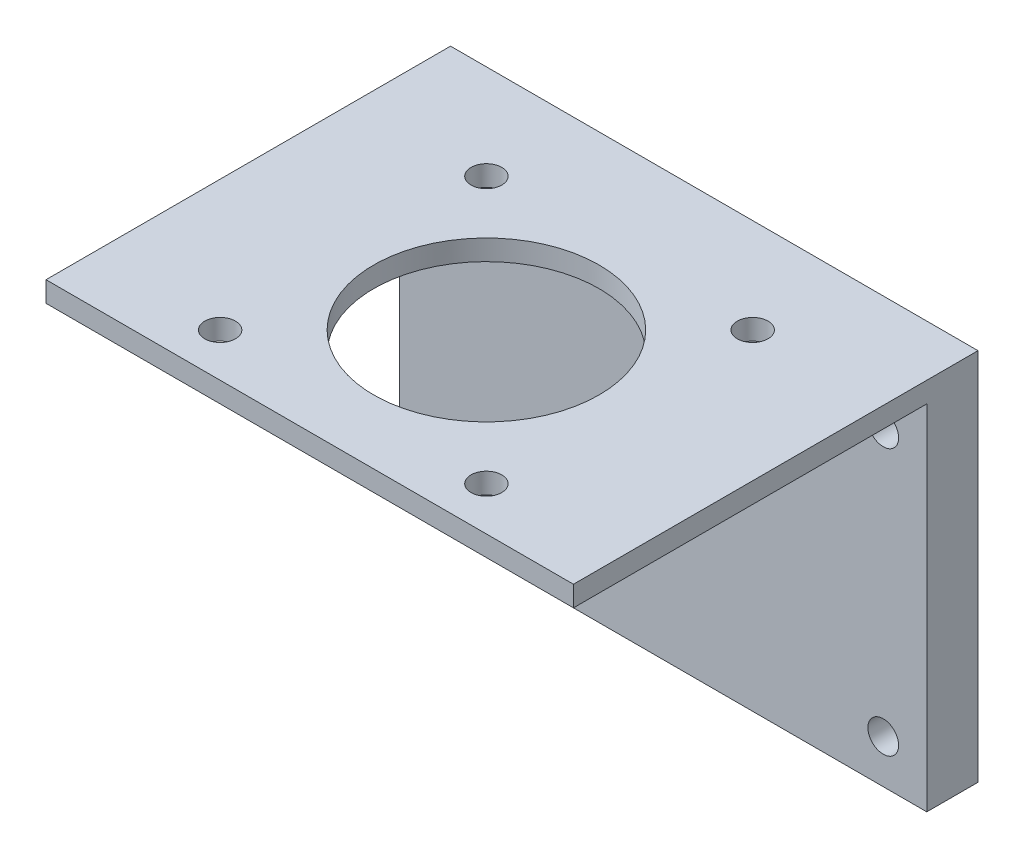
ISO-10303-21;
HEADER;
FILE_DESCRIPTION(('STEP AP214'),'2;1');
FILE_NAME('part.step','',(''),(''),'','','');
FILE_SCHEMA(('AUTOMOTIVE_DESIGN { 1 0 10303 214 1 1 1 1 }'));
ENDSEC;
DATA;
#1=APPLICATION_CONTEXT('core data for automotive mechanical design processes');
#2=APPLICATION_PROTOCOL_DEFINITION('international standard','automotive_design',2000,#1);
#3=PRODUCT_CONTEXT('',#1,'mechanical');
#4=PRODUCT('Part','Part','',(#3));
#5=PRODUCT_RELATED_PRODUCT_CATEGORY('part','',(#4));
#6=PRODUCT_DEFINITION_FORMATION('','',#4);
#7=PRODUCT_DEFINITION_CONTEXT('part definition',#1,'design');
#8=PRODUCT_DEFINITION('design','',#6,#7);
#9=PRODUCT_DEFINITION_SHAPE('','',#8);
#10=(LENGTH_UNIT() NAMED_UNIT(*) SI_UNIT(.MILLI.,.METRE.));
#11=(NAMED_UNIT(*) PLANE_ANGLE_UNIT() SI_UNIT($,.RADIAN.));
#12=(NAMED_UNIT(*) SI_UNIT($,.STERADIAN.) SOLID_ANGLE_UNIT());
#13=UNCERTAINTY_MEASURE_WITH_UNIT(LENGTH_MEASURE(1.E-05),#10,'distance_accuracy_value','');
#14=(GEOMETRIC_REPRESENTATION_CONTEXT(3) GLOBAL_UNCERTAINTY_ASSIGNED_CONTEXT((#13)) GLOBAL_UNIT_ASSIGNED_CONTEXT((#10,
#11,#12)) REPRESENTATION_CONTEXT('',''));
#15=CARTESIAN_POINT('',(0.,0.,0.));
#16=DIRECTION('',(0.,0.,1.));
#17=DIRECTION('',(1.,0.,0.));
#18=AXIS2_PLACEMENT_3D('',#15,#16,#17);
#19=CARTESIAN_POINT('',(-14.63219974067,10.8656583629893,5.));
#20=DIRECTION('',(1.,0.,0.));
#21=DIRECTION('',(0.,1.,0.));
#22=AXIS2_PLACEMENT_3D('',#19,#20,#21);
#23=PLANE('',#22);
#24=DIRECTION('',(0.,-1.,0.));
#25=VECTOR('',#24,1.);
#26=CARTESIAN_POINT('',(-14.63219974067,10.8656583629893,0.));
#27=LINE('',#26,#25);
#28=CARTESIAN_POINT('',(-14.63219974067,10.8656583629893,0.));
#29=VERTEX_POINT('',#28);
#30=CARTESIAN_POINT('',(-14.63219974067,-25.6343416370107,0.));
#31=VERTEX_POINT('',#30);
#32=EDGE_CURVE('E91',#29,#31,#27,.T.);
#33=ORIENTED_EDGE('',*,*,#32,.T.);
#34=DIRECTION('',(0.,0.,-1.));
#35=VECTOR('',#34,1.);
#36=CARTESIAN_POINT('',(-14.63219974067,-25.6343416370107,5.));
#37=LINE('',#36,#35);
#38=CARTESIAN_POINT('',(-14.63219974067,-25.6343416370107,5.));
#39=VERTEX_POINT('',#38);
#40=EDGE_CURVE('E11',#39,#31,#37,.T.);
#41=ORIENTED_EDGE('',*,*,#40,.F.);
#42=DIRECTION('',(0.,-1.,0.));
#43=VECTOR('',#42,1.);
#44=CARTESIAN_POINT('',(-14.63219974067,10.8656583629893,5.));
#45=LINE('',#44,#43);
#46=CARTESIAN_POINT('',(-14.63219974067,8.86565836298932,5.));
#47=VERTEX_POINT('',#46);
#48=EDGE_CURVE('E85',#47,#39,#45,.T.);
#49=ORIENTED_EDGE('',*,*,#48,.F.);
#50=DIRECTION('',(0.,0.,-1.));
#51=VECTOR('',#50,1.);
#52=CARTESIAN_POINT('',(-14.63219974067,8.86565836298932,39.5));
#53=LINE('',#52,#51);
#54=CARTESIAN_POINT('',(-14.63219974067,8.86565836298932,39.5));
#55=VERTEX_POINT('',#54);
#56=EDGE_CURVE('E119',#55,#47,#53,.T.);
#57=ORIENTED_EDGE('',*,*,#56,.F.);
#58=DIRECTION('',(0.,-1.,0.));
#59=VECTOR('',#58,1.);
#60=CARTESIAN_POINT('',(-14.63219974067,10.8656583629893,39.5));
#61=LINE('',#60,#59);
#62=CARTESIAN_POINT('',(-14.63219974067,10.8656583629893,39.5));
#63=VERTEX_POINT('',#62);
#64=EDGE_CURVE('E94',#63,#55,#61,.T.);
#65=ORIENTED_EDGE('',*,*,#64,.F.);
#66=DIRECTION('',(0.,0.,-1.));
#67=VECTOR('',#66,1.);
#68=CARTESIAN_POINT('',(-14.63219974067,10.8656583629893,5.));
#69=LINE('',#68,#67);
#70=EDGE_CURVE('E78',#63,#29,#69,.T.);
#71=ORIENTED_EDGE('',*,*,#70,.T.);
#72=EDGE_LOOP('',(#33,#41,#49,#57,#65,#71));
#73=FACE_BOUND('',#72,.T.);
#74=ADVANCED_FACE('F33',(#73),#23,.F.);
#75=CARTESIAN_POINT('',(-14.63219974067,-25.6343416370107,5.));
#76=DIRECTION('',(0.,1.,0.));
#77=DIRECTION('',(0.,0.,1.));
#78=AXIS2_PLACEMENT_3D('',#75,#76,#77);
#79=PLANE('',#78);
#80=DIRECTION('',(1.,0.,0.));
#81=VECTOR('',#80,1.);
#82=CARTESIAN_POINT('',(-14.63219974067,-25.6343416370107,0.));
#83=LINE('',#82,#81);
#84=CARTESIAN_POINT('',(36.86780025933,-25.6343416370107,0.));
#85=VERTEX_POINT('',#84);
#86=EDGE_CURVE('E99',#31,#85,#83,.T.);
#87=ORIENTED_EDGE('',*,*,#86,.T.);
#88=DIRECTION('',(0.,0.,-1.));
#89=VECTOR('',#88,1.);
#90=CARTESIAN_POINT('',(36.86780025933,-25.6343416370107,5.));
#91=LINE('',#90,#89);
#92=CARTESIAN_POINT('',(36.86780025933,-25.6343416370107,5.));
#93=VERTEX_POINT('',#92);
#94=EDGE_CURVE('E40',#93,#85,#91,.T.);
#95=ORIENTED_EDGE('',*,*,#94,.F.);
#96=DIRECTION('',(1.,0.,0.));
#97=VECTOR('',#96,1.);
#98=CARTESIAN_POINT('',(-14.63219974067,-25.6343416370107,5.));
#99=LINE('',#98,#97);
#100=EDGE_CURVE('E53',#39,#93,#99,.T.);
#101=ORIENTED_EDGE('',*,*,#100,.F.);
#102=ORIENTED_EDGE('',*,*,#40,.T.);
#103=EDGE_LOOP('',(#87,#95,#101,#102));
#104=FACE_BOUND('',#103,.T.);
#105=ADVANCED_FACE('F116',(#104),#79,.F.);
#106=CARTESIAN_POINT('',(36.86780025933,10.8656583629893,5.));
#107=DIRECTION('',(-1.,0.,0.));
#108=DIRECTION('',(0.,-1.,0.));
#109=AXIS2_PLACEMENT_3D('',#106,#107,#108);
#110=PLANE('',#109);
#111=DIRECTION('',(0.,1.,0.));
#112=VECTOR('',#111,1.);
#113=CARTESIAN_POINT('',(36.86780025933,10.8656583629893,0.));
#114=LINE('',#113,#112);
#115=CARTESIAN_POINT('',(36.86780025933,10.8656583629893,0.));
#116=VERTEX_POINT('',#115);
#117=EDGE_CURVE('E86',#85,#116,#114,.T.);
#118=ORIENTED_EDGE('',*,*,#117,.T.);
#119=DIRECTION('',(0.,0.,-1.));
#120=VECTOR('',#119,1.);
#121=CARTESIAN_POINT('',(36.86780025933,10.8656583629893,5.));
#122=LINE('',#121,#120);
#123=CARTESIAN_POINT('',(36.86780025933,10.8656583629893,39.5));
#124=VERTEX_POINT('',#123);
#125=EDGE_CURVE('E81',#124,#116,#122,.T.);
#126=ORIENTED_EDGE('',*,*,#125,.F.);
#127=DIRECTION('',(0.,1.,0.));
#128=VECTOR('',#127,1.);
#129=CARTESIAN_POINT('',(36.86780025933,8.86565836298932,39.5));
#130=LINE('',#129,#128);
#131=CARTESIAN_POINT('',(36.86780025933,8.86565836298932,39.5));
#132=VERTEX_POINT('',#131);
#133=EDGE_CURVE('E134',#132,#124,#130,.T.);
#134=ORIENTED_EDGE('',*,*,#133,.F.);
#135=DIRECTION('',(0.,0.,-1.));
#136=VECTOR('',#135,1.);
#137=CARTESIAN_POINT('',(36.86780025933,8.86565836298932,39.5));
#138=LINE('',#137,#136);
#139=CARTESIAN_POINT('',(36.86780025933,8.86565836298932,5.));
#140=VERTEX_POINT('',#139);
#141=EDGE_CURVE('E129',#132,#140,#138,.T.);
#142=ORIENTED_EDGE('',*,*,#141,.T.);
#143=DIRECTION('',(0.,1.,0.));
#144=VECTOR('',#143,1.);
#145=CARTESIAN_POINT('',(36.86780025933,10.8656583629893,5.));
#146=LINE('',#145,#144);
#147=EDGE_CURVE('E96',#93,#140,#146,.T.);
#148=ORIENTED_EDGE('',*,*,#147,.F.);
#149=ORIENTED_EDGE('',*,*,#94,.T.);
#150=EDGE_LOOP('',(#118,#126,#134,#142,#148,#149));
#151=FACE_BOUND('',#150,.T.);
#152=ADVANCED_FACE('F113',(#151),#110,.F.);
#153=CARTESIAN_POINT('',(-14.63219974067,10.8656583629893,5.));
#154=DIRECTION('',(0.,-1.,0.));
#155=DIRECTION('',(0.,0.,-1.));
#156=AXIS2_PLACEMENT_3D('',#153,#154,#155);
#157=PLANE('',#156);
#158=CARTESIAN_POINT('',(24.11780025933,10.8656583629893,35.25));
#159=DIRECTION('',(0.,-1.,0.));
#160=DIRECTION('',(0.,0.,-1.));
#161=AXIS2_PLACEMENT_3D('',#158,#159,#160);
#162=CIRCLE('',#161,1.5);
#163=CARTESIAN_POINT('',(24.11780025933,10.8656583629893,33.75));
#164=VERTEX_POINT('',#163);
#165=EDGE_CURVE('E169',#164,#164,#162,.T.);
#166=ORIENTED_EDGE('',*,*,#165,.T.);
#167=EDGE_LOOP('',(#166));
#168=FACE_BOUND('',#167,.T.);
#169=CARTESIAN_POINT('',(-1.88219974066997,10.8656583629893,9.25));
#170=DIRECTION('',(0.,-1.,0.));
#171=DIRECTION('',(0.,0.,-1.));
#172=AXIS2_PLACEMENT_3D('',#169,#170,#171);
#173=CIRCLE('',#172,1.5);
#174=CARTESIAN_POINT('',(-1.88219974066997,10.8656583629893,7.75));
#175=VERTEX_POINT('',#174);
#176=EDGE_CURVE('E171',#175,#175,#173,.T.);
#177=ORIENTED_EDGE('',*,*,#176,.T.);
#178=EDGE_LOOP('',(#177));
#179=FACE_BOUND('',#178,.T.);
#180=CARTESIAN_POINT('',(24.11780025933,10.8656583629893,9.25));
#181=DIRECTION('',(0.,-1.,0.));
#182=DIRECTION('',(0.,0.,-1.));
#183=AXIS2_PLACEMENT_3D('',#180,#181,#182);
#184=CIRCLE('',#183,1.5);
#185=CARTESIAN_POINT('',(24.11780025933,10.8656583629893,7.75));
#186=VERTEX_POINT('',#185);
#187=EDGE_CURVE('E175',#186,#186,#184,.T.);
#188=ORIENTED_EDGE('',*,*,#187,.T.);
#189=EDGE_LOOP('',(#188));
#190=FACE_BOUND('',#189,.T.);
#191=CARTESIAN_POINT('',(11.11780025933,10.8656583629893,22.25));
#192=DIRECTION('',(0.,-1.,0.));
#193=DIRECTION('',(0.,0.,-1.));
#194=AXIS2_PLACEMENT_3D('',#191,#192,#193);
#195=CIRCLE('',#194,11.);
#196=CARTESIAN_POINT('',(11.11780025933,10.8656583629893,11.25));
#197=VERTEX_POINT('',#196);
#198=EDGE_CURVE('E180',#197,#197,#195,.T.);
#199=ORIENTED_EDGE('',*,*,#198,.T.);
#200=EDGE_LOOP('',(#199));
#201=FACE_BOUND('',#200,.T.);
#202=CARTESIAN_POINT('',(-1.88219974066997,10.8656583629893,35.25));
#203=DIRECTION('',(0.,-1.,0.));
#204=DIRECTION('',(0.,0.,-1.));
#205=AXIS2_PLACEMENT_3D('',#202,#203,#204);
#206=CIRCLE('',#205,1.5);
#207=CARTESIAN_POINT('',(-1.88219974066997,10.8656583629893,33.75));
#208=VERTEX_POINT('',#207);
#209=EDGE_CURVE('E183',#208,#208,#206,.T.);
#210=ORIENTED_EDGE('',*,*,#209,.T.);
#211=EDGE_LOOP('',(#210));
#212=FACE_BOUND('',#211,.T.);
#213=DIRECTION('',(-1.,0.,0.));
#214=VECTOR('',#213,1.);
#215=CARTESIAN_POINT('',(-14.63219974067,10.8656583629893,0.));
#216=LINE('',#215,#214);
#217=EDGE_CURVE('E73',#116,#29,#216,.T.);
#218=ORIENTED_EDGE('',*,*,#217,.T.);
#219=ORIENTED_EDGE('',*,*,#70,.F.);
#220=DIRECTION('',(-1.,0.,0.));
#221=VECTOR('',#220,1.);
#222=CARTESIAN_POINT('',(36.86780025933,10.8656583629893,39.5));
#223=LINE('',#222,#221);
#224=EDGE_CURVE('E163',#124,#63,#223,.T.);
#225=ORIENTED_EDGE('',*,*,#224,.F.);
#226=ORIENTED_EDGE('',*,*,#125,.T.);
#227=EDGE_LOOP('',(#218,#219,#225,#226));
#228=FACE_BOUND('',#227,.T.);
#229=ADVANCED_FACE('F75',(#168,#179,#190,#201,#212,#228),#157,.F.);
#230=CARTESIAN_POINT('',(0.,0.,5.));
#231=DIRECTION('',(0.,0.,1.));
#232=DIRECTION('',(1.,0.,0.));
#233=AXIS2_PLACEMENT_3D('',#230,#231,#232);
#234=PLANE('',#233);
#235=DIRECTION('',(1.,0.,0.));
#236=VECTOR('',#235,1.);
#237=CARTESIAN_POINT('',(-14.63219974067,8.86565836298932,5.));
#238=LINE('',#237,#236);
#239=EDGE_CURVE('E47',#47,#140,#238,.T.);
#240=ORIENTED_EDGE('',*,*,#239,.F.);
#241=ORIENTED_EDGE('',*,*,#48,.T.);
#242=ORIENTED_EDGE('',*,*,#100,.T.);
#243=ORIENTED_EDGE('',*,*,#147,.T.);
#244=EDGE_LOOP('',(#240,#241,#242,#243));
#245=FACE_BOUND('',#244,.T.);
#246=CARTESIAN_POINT('',(32.61780025933,4.61565836298932,5.));
#247=DIRECTION('',(0.,0.,1.));
#248=DIRECTION('',(1.,0.,0.));
#249=AXIS2_PLACEMENT_3D('',#246,#247,#248);
#250=CIRCLE('',#249,1.5);
#251=CARTESIAN_POINT('',(34.11780025933,4.61565836298932,5.));
#252=VERTEX_POINT('',#251);
#253=EDGE_CURVE('E128',#252,#252,#250,.T.);
#254=ORIENTED_EDGE('',*,*,#253,.F.);
#255=EDGE_LOOP('',(#254));
#256=FACE_BOUND('',#255,.T.);
#257=CARTESIAN_POINT('',(32.61780025933,-21.3843416370107,5.));
#258=DIRECTION('',(0.,0.,1.));
#259=DIRECTION('',(1.,0.,0.));
#260=AXIS2_PLACEMENT_3D('',#257,#258,#259);
#261=CIRCLE('',#260,1.5);
#262=CARTESIAN_POINT('',(34.11780025933,-21.3843416370107,5.));
#263=VERTEX_POINT('',#262);
#264=EDGE_CURVE('E147',#263,#263,#261,.T.);
#265=ORIENTED_EDGE('',*,*,#264,.F.);
#266=EDGE_LOOP('',(#265));
#267=FACE_BOUND('',#266,.T.);
#268=CARTESIAN_POINT('',(-10.38219974067,-21.3843416370107,5.));
#269=DIRECTION('',(0.,0.,1.));
#270=DIRECTION('',(1.,0.,0.));
#271=AXIS2_PLACEMENT_3D('',#268,#269,#270);
#272=CIRCLE('',#271,1.5);
#273=CARTESIAN_POINT('',(-8.88219974066997,-21.3843416370107,5.));
#274=VERTEX_POINT('',#273);
#275=EDGE_CURVE('E141',#274,#274,#272,.T.);
#276=ORIENTED_EDGE('',*,*,#275,.F.);
#277=EDGE_LOOP('',(#276));
#278=FACE_BOUND('',#277,.T.);
#279=CARTESIAN_POINT('',(-10.38219974067,4.61565836298932,5.));
#280=DIRECTION('',(0.,0.,1.));
#281=DIRECTION('',(1.,0.,0.));
#282=AXIS2_PLACEMENT_3D('',#279,#280,#281);
#283=CIRCLE('',#282,1.5);
#284=CARTESIAN_POINT('',(-8.88219974066997,4.61565836298932,5.));
#285=VERTEX_POINT('',#284);
#286=EDGE_CURVE('E104',#285,#285,#283,.T.);
#287=ORIENTED_EDGE('',*,*,#286,.F.);
#288=EDGE_LOOP('',(#287));
#289=FACE_BOUND('',#288,.T.);
#290=ADVANCED_FACE('F153',(#245,#256,#267,#278,#289),#234,.T.);
#291=CARTESIAN_POINT('',(0.,0.,0.));
#292=DIRECTION('',(0.,0.,1.));
#293=DIRECTION('',(1.,0.,0.));
#294=AXIS2_PLACEMENT_3D('',#291,#292,#293);
#295=PLANE('',#294);
#296=CARTESIAN_POINT('',(32.61780025933,4.61565836298932,0.));
#297=DIRECTION('',(0.,0.,1.));
#298=DIRECTION('',(1.,0.,0.));
#299=AXIS2_PLACEMENT_3D('',#296,#297,#298);
#300=CIRCLE('',#299,1.5);
#301=CARTESIAN_POINT('',(34.11780025933,4.61565836298932,0.));
#302=VERTEX_POINT('',#301);
#303=EDGE_CURVE('E132',#302,#302,#300,.T.);
#304=ORIENTED_EDGE('',*,*,#303,.T.);
#305=EDGE_LOOP('',(#304));
#306=FACE_BOUND('',#305,.T.);
#307=CARTESIAN_POINT('',(32.61780025933,-21.3843416370107,0.));
#308=DIRECTION('',(0.,0.,1.));
#309=DIRECTION('',(1.,0.,0.));
#310=AXIS2_PLACEMENT_3D('',#307,#308,#309);
#311=CIRCLE('',#310,1.5);
#312=CARTESIAN_POINT('',(34.11780025933,-21.3843416370107,0.));
#313=VERTEX_POINT('',#312);
#314=EDGE_CURVE('E144',#313,#313,#311,.T.);
#315=ORIENTED_EDGE('',*,*,#314,.T.);
#316=EDGE_LOOP('',(#315));
#317=FACE_BOUND('',#316,.T.);
#318=CARTESIAN_POINT('',(-10.38219974067,-21.3843416370107,0.));
#319=DIRECTION('',(0.,0.,1.));
#320=DIRECTION('',(1.,0.,0.));
#321=AXIS2_PLACEMENT_3D('',#318,#319,#320);
#322=CIRCLE('',#321,1.5);
#323=CARTESIAN_POINT('',(-8.88219974066997,-21.3843416370107,0.));
#324=VERTEX_POINT('',#323);
#325=EDGE_CURVE('E138',#324,#324,#322,.T.);
#326=ORIENTED_EDGE('',*,*,#325,.T.);
#327=EDGE_LOOP('',(#326));
#328=FACE_BOUND('',#327,.T.);
#329=CARTESIAN_POINT('',(-10.38219974067,4.61565836298932,0.));
#330=DIRECTION('',(0.,0.,1.));
#331=DIRECTION('',(1.,0.,0.));
#332=AXIS2_PLACEMENT_3D('',#329,#330,#331);
#333=CIRCLE('',#332,1.5);
#334=CARTESIAN_POINT('',(-8.88219974066997,4.61565836298932,0.));
#335=VERTEX_POINT('',#334);
#336=EDGE_CURVE('E100',#335,#335,#333,.T.);
#337=ORIENTED_EDGE('',*,*,#336,.T.);
#338=EDGE_LOOP('',(#337));
#339=FACE_BOUND('',#338,.T.);
#340=ORIENTED_EDGE('',*,*,#32,.F.);
#341=ORIENTED_EDGE('',*,*,#217,.F.);
#342=ORIENTED_EDGE('',*,*,#117,.F.);
#343=ORIENTED_EDGE('',*,*,#86,.F.);
#344=EDGE_LOOP('',(#340,#341,#342,#343));
#345=FACE_BOUND('',#344,.T.);
#346=ADVANCED_FACE('F98',(#306,#317,#328,#339,#345),#295,.F.);
#347=CARTESIAN_POINT('',(-10.38219974067,4.61565836298932,0.));
#348=DIRECTION('',(0.,0.,1.));
#349=DIRECTION('',(1.,0.,0.));
#350=AXIS2_PLACEMENT_3D('',#347,#348,#349);
#351=CYLINDRICAL_SURFACE('',#350,1.5);
#352=ORIENTED_EDGE('',*,*,#336,.F.);
#353=EDGE_LOOP('',(#352));
#354=FACE_BOUND('',#353,.T.);
#355=ORIENTED_EDGE('',*,*,#286,.T.);
#356=EDGE_LOOP('',(#355));
#357=FACE_BOUND('',#356,.T.);
#358=ADVANCED_FACE('F327',(#354,#357),#351,.F.);
#359=CARTESIAN_POINT('',(-10.38219974067,-21.3843416370107,0.));
#360=DIRECTION('',(0.,0.,1.));
#361=DIRECTION('',(1.,0.,0.));
#362=AXIS2_PLACEMENT_3D('',#359,#360,#361);
#363=CYLINDRICAL_SURFACE('',#362,1.5);
#364=ORIENTED_EDGE('',*,*,#325,.F.);
#365=EDGE_LOOP('',(#364));
#366=FACE_BOUND('',#365,.T.);
#367=ORIENTED_EDGE('',*,*,#275,.T.);
#368=EDGE_LOOP('',(#367));
#369=FACE_BOUND('',#368,.T.);
#370=ADVANCED_FACE('F323',(#366,#369),#363,.F.);
#371=CARTESIAN_POINT('',(32.61780025933,-21.3843416370107,0.));
#372=DIRECTION('',(0.,0.,1.));
#373=DIRECTION('',(1.,0.,0.));
#374=AXIS2_PLACEMENT_3D('',#371,#372,#373);
#375=CYLINDRICAL_SURFACE('',#374,1.5);
#376=ORIENTED_EDGE('',*,*,#314,.F.);
#377=EDGE_LOOP('',(#376));
#378=FACE_BOUND('',#377,.T.);
#379=ORIENTED_EDGE('',*,*,#264,.T.);
#380=EDGE_LOOP('',(#379));
#381=FACE_BOUND('',#380,.T.);
#382=ADVANCED_FACE('F326',(#378,#381),#375,.F.);
#383=CARTESIAN_POINT('',(32.61780025933,4.61565836298932,0.));
#384=DIRECTION('',(0.,0.,1.));
#385=DIRECTION('',(1.,0.,0.));
#386=AXIS2_PLACEMENT_3D('',#383,#384,#385);
#387=CYLINDRICAL_SURFACE('',#386,1.5);
#388=ORIENTED_EDGE('',*,*,#303,.F.);
#389=EDGE_LOOP('',(#388));
#390=FACE_BOUND('',#389,.T.);
#391=ORIENTED_EDGE('',*,*,#253,.T.);
#392=EDGE_LOOP('',(#391));
#393=FACE_BOUND('',#392,.T.);
#394=ADVANCED_FACE('F207',(#390,#393),#387,.F.);
#395=CARTESIAN_POINT('',(-14.63219974067,8.86565836298932,39.5));
#396=DIRECTION('',(0.,1.,0.));
#397=DIRECTION('',(-1.,0.,0.));
#398=AXIS2_PLACEMENT_3D('',#395,#396,#397);
#399=PLANE('',#398);
#400=CARTESIAN_POINT('',(24.11780025933,8.86565836298932,35.25));
#401=DIRECTION('',(0.,-1.,0.));
#402=DIRECTION('',(1.,0.,0.));
#403=AXIS2_PLACEMENT_3D('',#400,#401,#402);
#404=CIRCLE('',#403,1.5);
#405=CARTESIAN_POINT('',(25.61780025933,8.86565836298932,35.25));
#406=VERTEX_POINT('',#405);
#407=EDGE_CURVE('E189',#406,#406,#404,.T.);
#408=ORIENTED_EDGE('',*,*,#407,.F.);
#409=EDGE_LOOP('',(#408));
#410=FACE_BOUND('',#409,.T.);
#411=CARTESIAN_POINT('',(-1.88219974066997,8.86565836298932,9.25));
#412=DIRECTION('',(0.,-1.,0.));
#413=DIRECTION('',(1.,0.,0.));
#414=AXIS2_PLACEMENT_3D('',#411,#412,#413);
#415=CIRCLE('',#414,1.5);
#416=CARTESIAN_POINT('',(-0.382199740669972,8.86565836298932,9.25));
#417=VERTEX_POINT('',#416);
#418=EDGE_CURVE('E190',#417,#417,#415,.T.);
#419=ORIENTED_EDGE('',*,*,#418,.F.);
#420=EDGE_LOOP('',(#419));
#421=FACE_BOUND('',#420,.T.);
#422=CARTESIAN_POINT('',(24.11780025933,8.86565836298932,9.25));
#423=DIRECTION('',(0.,-1.,0.));
#424=DIRECTION('',(1.,0.,0.));
#425=AXIS2_PLACEMENT_3D('',#422,#423,#424);
#426=CIRCLE('',#425,1.5);
#427=CARTESIAN_POINT('',(25.61780025933,8.86565836298932,9.25));
#428=VERTEX_POINT('',#427);
#429=EDGE_CURVE('E193',#428,#428,#426,.T.);
#430=ORIENTED_EDGE('',*,*,#429,.F.);
#431=EDGE_LOOP('',(#430));
#432=FACE_BOUND('',#431,.T.);
#433=CARTESIAN_POINT('',(11.11780025933,8.86565836298932,22.25));
#434=DIRECTION('',(0.,-1.,0.));
#435=DIRECTION('',(1.,0.,0.));
#436=AXIS2_PLACEMENT_3D('',#433,#434,#435);
#437=CIRCLE('',#436,11.);
#438=CARTESIAN_POINT('',(22.11780025933,8.86565836298932,22.25));
#439=VERTEX_POINT('',#438);
#440=EDGE_CURVE('E196',#439,#439,#437,.T.);
#441=ORIENTED_EDGE('',*,*,#440,.F.);
#442=EDGE_LOOP('',(#441));
#443=FACE_BOUND('',#442,.T.);
#444=CARTESIAN_POINT('',(-1.88219974066997,8.86565836298932,35.25));
#445=DIRECTION('',(0.,-1.,0.));
#446=DIRECTION('',(1.,0.,0.));
#447=AXIS2_PLACEMENT_3D('',#444,#445,#446);
#448=CIRCLE('',#447,1.5);
#449=CARTESIAN_POINT('',(-0.382199740669971,8.86565836298932,35.25));
#450=VERTEX_POINT('',#449);
#451=EDGE_CURVE('E186',#450,#450,#448,.T.);
#452=ORIENTED_EDGE('',*,*,#451,.F.);
#453=EDGE_LOOP('',(#452));
#454=FACE_BOUND('',#453,.T.);
#455=ORIENTED_EDGE('',*,*,#239,.T.);
#456=ORIENTED_EDGE('',*,*,#141,.F.);
#457=DIRECTION('',(1.,0.,0.));
#458=VECTOR('',#457,1.);
#459=CARTESIAN_POINT('',(-14.63219974067,8.86565836298932,39.5));
#460=LINE('',#459,#458);
#461=EDGE_CURVE('E127',#55,#132,#460,.T.);
#462=ORIENTED_EDGE('',*,*,#461,.F.);
#463=ORIENTED_EDGE('',*,*,#56,.T.);
#464=EDGE_LOOP('',(#455,#456,#462,#463));
#465=FACE_BOUND('',#464,.T.);
#466=ADVANCED_FACE('F123',(#410,#421,#432,#443,#454,#465),#399,.F.);
#467=CARTESIAN_POINT('',(0.,0.,39.5));
#468=DIRECTION('',(0.,0.,1.));
#469=DIRECTION('',(1.,0.,0.));
#470=AXIS2_PLACEMENT_3D('',#467,#468,#469);
#471=PLANE('',#470);
#472=ORIENTED_EDGE('',*,*,#224,.T.);
#473=ORIENTED_EDGE('',*,*,#64,.T.);
#474=ORIENTED_EDGE('',*,*,#461,.T.);
#475=ORIENTED_EDGE('',*,*,#133,.T.);
#476=EDGE_LOOP('',(#472,#473,#474,#475));
#477=FACE_BOUND('',#476,.T.);
#478=ADVANCED_FACE('F161',(#477),#471,.T.);
#479=CARTESIAN_POINT('',(-1.88219974066997,43.3656583629893,35.25));
#480=DIRECTION('',(0.,-1.,0.));
#481=DIRECTION('',(1.,0.,0.));
#482=AXIS2_PLACEMENT_3D('',#479,#480,#481);
#483=CYLINDRICAL_SURFACE('',#482,1.5);
#484=ORIENTED_EDGE('',*,*,#451,.T.);
#485=EDGE_LOOP('',(#484));
#486=FACE_BOUND('',#485,.T.);
#487=ORIENTED_EDGE('',*,*,#209,.F.);
#488=EDGE_LOOP('',(#487));
#489=FACE_BOUND('',#488,.T.);
#490=ADVANCED_FACE('F214',(#486,#489),#483,.F.);
#491=CARTESIAN_POINT('',(11.11780025933,43.3656583629893,22.25));
#492=DIRECTION('',(0.,-1.,0.));
#493=DIRECTION('',(1.,0.,0.));
#494=AXIS2_PLACEMENT_3D('',#491,#492,#493);
#495=CYLINDRICAL_SURFACE('',#494,11.);
#496=ORIENTED_EDGE('',*,*,#440,.T.);
#497=EDGE_LOOP('',(#496));
#498=FACE_BOUND('',#497,.T.);
#499=ORIENTED_EDGE('',*,*,#198,.F.);
#500=EDGE_LOOP('',(#499));
#501=FACE_BOUND('',#500,.T.);
#502=ADVANCED_FACE('F217',(#498,#501),#495,.F.);
#503=CARTESIAN_POINT('',(24.11780025933,43.3656583629893,9.25));
#504=DIRECTION('',(0.,-1.,0.));
#505=DIRECTION('',(1.,0.,0.));
#506=AXIS2_PLACEMENT_3D('',#503,#504,#505);
#507=CYLINDRICAL_SURFACE('',#506,1.5);
#508=ORIENTED_EDGE('',*,*,#429,.T.);
#509=EDGE_LOOP('',(#508));
#510=FACE_BOUND('',#509,.T.);
#511=ORIENTED_EDGE('',*,*,#187,.F.);
#512=EDGE_LOOP('',(#511));
#513=FACE_BOUND('',#512,.T.);
#514=ADVANCED_FACE('F202',(#510,#513),#507,.F.);
#515=CARTESIAN_POINT('',(-1.88219974066997,43.3656583629893,9.25));
#516=DIRECTION('',(0.,-1.,0.));
#517=DIRECTION('',(1.,0.,0.));
#518=AXIS2_PLACEMENT_3D('',#515,#516,#517);
#519=CYLINDRICAL_SURFACE('',#518,1.5);
#520=ORIENTED_EDGE('',*,*,#418,.T.);
#521=EDGE_LOOP('',(#520));
#522=FACE_BOUND('',#521,.T.);
#523=ORIENTED_EDGE('',*,*,#176,.F.);
#524=EDGE_LOOP('',(#523));
#525=FACE_BOUND('',#524,.T.);
#526=ADVANCED_FACE('F298',(#522,#525),#519,.F.);
#527=CARTESIAN_POINT('',(24.11780025933,43.3656583629893,35.25));
#528=DIRECTION('',(0.,-1.,0.));
#529=DIRECTION('',(1.,0.,0.));
#530=AXIS2_PLACEMENT_3D('',#527,#528,#529);
#531=CYLINDRICAL_SURFACE('',#530,1.5);
#532=ORIENTED_EDGE('',*,*,#407,.T.);
#533=EDGE_LOOP('',(#532));
#534=FACE_BOUND('',#533,.T.);
#535=ORIENTED_EDGE('',*,*,#165,.F.);
#536=EDGE_LOOP('',(#535));
#537=FACE_BOUND('',#536,.T.);
#538=ADVANCED_FACE('F307',(#534,#537),#531,.F.);
#539=CLOSED_SHELL('',(#74,#105,#152,#229,#290,#346,#358,#370,#382,#394,#466,#478,#490,#502,#514,
#526,#538));
#540=MANIFOLD_SOLID_BREP('B2',#539);
#541=ADVANCED_BREP_SHAPE_REPRESENTATION('',(#18,#540),#14);
#542=SHAPE_DEFINITION_REPRESENTATION(#9,#541);
ENDSEC;
END-ISO-10303-21;
